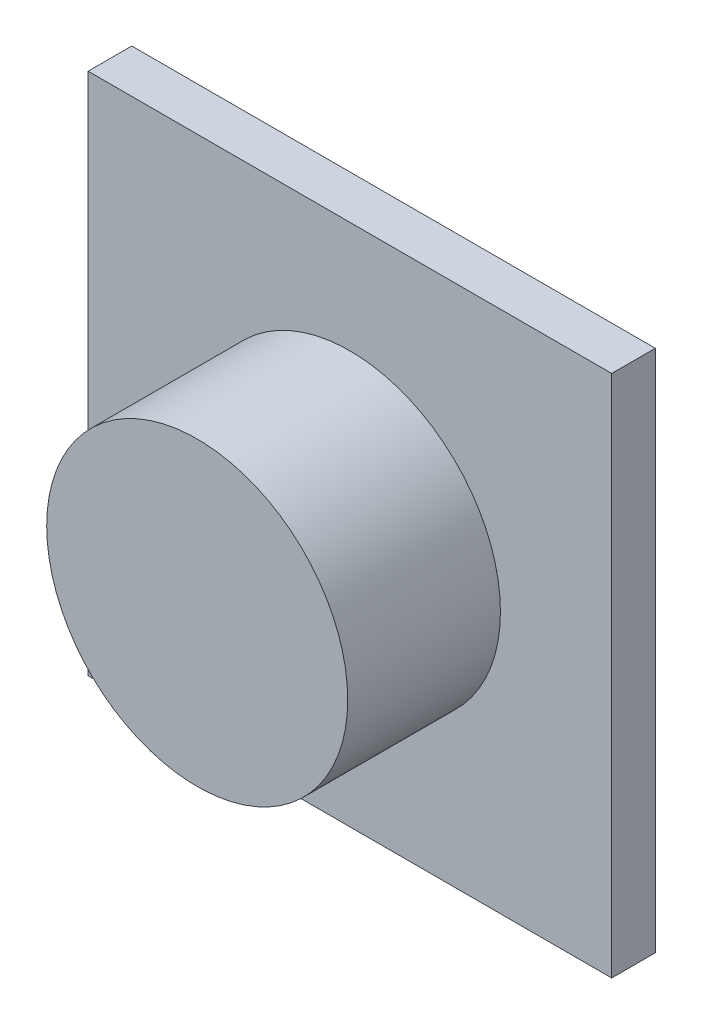
ISO-10303-21;
HEADER;
FILE_DESCRIPTION(('STEP AP214'),'2;1');
FILE_NAME('part.step','',(''),(''),'','','');
FILE_SCHEMA(('AUTOMOTIVE_DESIGN { 1 0 10303 214 1 1 1 1 }'));
ENDSEC;
DATA;
#1=APPLICATION_CONTEXT('core data for automotive mechanical design processes');
#2=APPLICATION_PROTOCOL_DEFINITION('international standard','automotive_design',2000,#1);
#3=PRODUCT_CONTEXT('',#1,'mechanical');
#4=PRODUCT('Part','Part','',(#3));
#5=PRODUCT_RELATED_PRODUCT_CATEGORY('part','',(#4));
#6=PRODUCT_DEFINITION_FORMATION('','',#4);
#7=PRODUCT_DEFINITION_CONTEXT('part definition',#1,'design');
#8=PRODUCT_DEFINITION('design','',#6,#7);
#9=PRODUCT_DEFINITION_SHAPE('','',#8);
#10=(LENGTH_UNIT() NAMED_UNIT(*) SI_UNIT(.MILLI.,.METRE.));
#11=(NAMED_UNIT(*) PLANE_ANGLE_UNIT() SI_UNIT($,.RADIAN.));
#12=(NAMED_UNIT(*) SI_UNIT($,.STERADIAN.) SOLID_ANGLE_UNIT());
#13=UNCERTAINTY_MEASURE_WITH_UNIT(LENGTH_MEASURE(1.E-05),#10,'distance_accuracy_value','');
#14=(GEOMETRIC_REPRESENTATION_CONTEXT(3) GLOBAL_UNCERTAINTY_ASSIGNED_CONTEXT((#13)) GLOBAL_UNIT_ASSIGNED_CONTEXT((#10,
#11,#12)) REPRESENTATION_CONTEXT('',''));
#15=CARTESIAN_POINT('',(0.,0.,0.));
#16=DIRECTION('',(0.,0.,1.));
#17=DIRECTION('',(1.,0.,0.));
#18=AXIS2_PLACEMENT_3D('',#15,#16,#17);
#19=CARTESIAN_POINT('',(-10.3425605536332,-5.83667820069204,1.));
#20=DIRECTION('',(0.,1.,0.));
#21=DIRECTION('',(0.,0.,1.));
#22=AXIS2_PLACEMENT_3D('',#19,#20,#21);
#23=PLANE('',#22);
#24=DIRECTION('',(1.,0.,0.));
#25=VECTOR('',#24,1.);
#26=CARTESIAN_POINT('',(-10.3425605536332,-5.83667820069204,0.));
#27=LINE('',#26,#25);
#28=CARTESIAN_POINT('',(-10.3425605536332,-5.83667820069204,0.));
#29=VERTEX_POINT('',#28);
#30=CARTESIAN_POINT('',(1.65743944636678,-5.83667820069204,0.));
#31=VERTEX_POINT('',#30);
#32=EDGE_CURVE('E109',#29,#31,#27,.T.);
#33=ORIENTED_EDGE('',*,*,#32,.T.);
#34=DIRECTION('',(0.,0.,-1.));
#35=VECTOR('',#34,1.);
#36=CARTESIAN_POINT('',(1.65743944636678,-5.83667820069204,1.));
#37=LINE('',#36,#35);
#38=CARTESIAN_POINT('',(1.65743944636678,-5.83667820069204,1.));
#39=VERTEX_POINT('',#38);
#40=EDGE_CURVE('E42',#39,#31,#37,.T.);
#41=ORIENTED_EDGE('',*,*,#40,.F.);
#42=DIRECTION('',(1.,0.,0.));
#43=VECTOR('',#42,1.);
#44=CARTESIAN_POINT('',(-10.3425605536332,-5.83667820069204,1.));
#45=LINE('',#44,#43);
#46=CARTESIAN_POINT('',(-10.3425605536332,-5.83667820069204,1.));
#47=VERTEX_POINT('',#46);
#48=EDGE_CURVE('E81',#47,#39,#45,.T.);
#49=ORIENTED_EDGE('',*,*,#48,.F.);
#50=DIRECTION('',(0.,0.,-1.));
#51=VECTOR('',#50,1.);
#52=CARTESIAN_POINT('',(-10.3425605536332,-5.83667820069204,1.));
#53=LINE('',#52,#51);
#54=EDGE_CURVE('E105',#47,#29,#53,.T.);
#55=ORIENTED_EDGE('',*,*,#54,.T.);
#56=EDGE_LOOP('',(#33,#41,#49,#55));
#57=FACE_BOUND('',#56,.T.);
#58=ADVANCED_FACE('F39',(#57),#23,.F.);
#59=CARTESIAN_POINT('',(1.65743944636678,6.16332179930796,1.));
#60=DIRECTION('',(1.,0.,0.));
#61=DIRECTION('',(0.,1.,0.));
#62=AXIS2_PLACEMENT_3D('',#59,#60,#61);
#63=PLANE('',#62);
#64=DIRECTION('',(0.,-1.,0.));
#65=VECTOR('',#64,1.);
#66=CARTESIAN_POINT('',(1.65743944636678,6.16332179930796,0.));
#67=LINE('',#66,#65);
#68=CARTESIAN_POINT('',(1.65743944636678,6.16332179930796,0.));
#69=VERTEX_POINT('',#68);
#70=EDGE_CURVE('E91',#69,#31,#67,.T.);
#71=ORIENTED_EDGE('',*,*,#70,.F.);
#72=DIRECTION('',(0.,0.,-1.));
#73=VECTOR('',#72,1.);
#74=CARTESIAN_POINT('',(1.65743944636678,6.16332179930796,1.));
#75=LINE('',#74,#73);
#76=CARTESIAN_POINT('',(1.65743944636678,6.16332179930796,1.));
#77=VERTEX_POINT('',#76);
#78=EDGE_CURVE('E87',#77,#69,#75,.T.);
#79=ORIENTED_EDGE('',*,*,#78,.F.);
#80=DIRECTION('',(0.,-1.,0.));
#81=VECTOR('',#80,1.);
#82=CARTESIAN_POINT('',(1.65743944636678,6.16332179930796,1.));
#83=LINE('',#82,#81);
#84=EDGE_CURVE('E89',#77,#39,#83,.T.);
#85=ORIENTED_EDGE('',*,*,#84,.T.);
#86=ORIENTED_EDGE('',*,*,#40,.T.);
#87=EDGE_LOOP('',(#71,#79,#85,#86));
#88=FACE_BOUND('',#87,.T.);
#89=ADVANCED_FACE('F88',(#88),#63,.T.);
#90=CARTESIAN_POINT('',(-10.3425605536332,6.16332179930796,1.));
#91=DIRECTION('',(0.,1.,0.));
#92=DIRECTION('',(0.,0.,1.));
#93=AXIS2_PLACEMENT_3D('',#90,#91,#92);
#94=PLANE('',#93);
#95=DIRECTION('',(1.,0.,0.));
#96=VECTOR('',#95,1.);
#97=CARTESIAN_POINT('',(-10.3425605536332,6.16332179930796,0.));
#98=LINE('',#97,#96);
#99=CARTESIAN_POINT('',(-10.3425605536332,6.16332179930796,0.));
#100=VERTEX_POINT('',#99);
#101=EDGE_CURVE('E116',#100,#69,#98,.T.);
#102=ORIENTED_EDGE('',*,*,#101,.F.);
#103=DIRECTION('',(0.,0.,-1.));
#104=VECTOR('',#103,1.);
#105=CARTESIAN_POINT('',(-10.3425605536332,6.16332179930796,1.));
#106=LINE('',#105,#104);
#107=CARTESIAN_POINT('',(-10.3425605536332,6.16332179930796,1.));
#108=VERTEX_POINT('',#107);
#109=EDGE_CURVE('E73',#108,#100,#106,.T.);
#110=ORIENTED_EDGE('',*,*,#109,.F.);
#111=DIRECTION('',(1.,0.,0.));
#112=VECTOR('',#111,1.);
#113=CARTESIAN_POINT('',(-10.3425605536332,6.16332179930796,1.));
#114=LINE('',#113,#112);
#115=EDGE_CURVE('E98',#108,#77,#114,.T.);
#116=ORIENTED_EDGE('',*,*,#115,.T.);
#117=ORIENTED_EDGE('',*,*,#78,.T.);
#118=EDGE_LOOP('',(#102,#110,#116,#117));
#119=FACE_BOUND('',#118,.T.);
#120=ADVANCED_FACE('F101',(#119),#94,.T.);
#121=CARTESIAN_POINT('',(-10.3425605536332,6.16332179930796,1.));
#122=DIRECTION('',(1.,0.,0.));
#123=DIRECTION('',(0.,1.,0.));
#124=AXIS2_PLACEMENT_3D('',#121,#122,#123);
#125=PLANE('',#124);
#126=DIRECTION('',(0.,-1.,0.));
#127=VECTOR('',#126,1.);
#128=CARTESIAN_POINT('',(-10.3425605536332,6.16332179930796,0.));
#129=LINE('',#128,#127);
#130=EDGE_CURVE('E76',#100,#29,#129,.T.);
#131=ORIENTED_EDGE('',*,*,#130,.T.);
#132=ORIENTED_EDGE('',*,*,#54,.F.);
#133=DIRECTION('',(0.,-1.,0.));
#134=VECTOR('',#133,1.);
#135=CARTESIAN_POINT('',(-10.3425605536332,6.16332179930796,1.));
#136=LINE('',#135,#134);
#137=EDGE_CURVE('E57',#108,#47,#136,.T.);
#138=ORIENTED_EDGE('',*,*,#137,.F.);
#139=ORIENTED_EDGE('',*,*,#109,.T.);
#140=EDGE_LOOP('',(#131,#132,#138,#139));
#141=FACE_BOUND('',#140,.T.);
#142=ADVANCED_FACE('F139',(#141),#125,.F.);
#143=CARTESIAN_POINT('',(0.,0.,1.));
#144=DIRECTION('',(0.,0.,-1.));
#145=DIRECTION('',(-1.,0.,0.));
#146=AXIS2_PLACEMENT_3D('',#143,#144,#145);
#147=PLANE('',#146);
#148=CARTESIAN_POINT('',(-4.34256055363322,0.163321799307959,1.));
#149=DIRECTION('',(0.,0.,1.));
#150=DIRECTION('',(1.,0.,0.));
#151=AXIS2_PLACEMENT_3D('',#148,#149,#150);
#152=CIRCLE('',#151,3.45);
#153=CARTESIAN_POINT('',(-0.892560553633223,0.163321799307959,1.));
#154=VERTEX_POINT('',#153);
#155=EDGE_CURVE('E11',#154,#154,#152,.T.);
#156=ORIENTED_EDGE('',*,*,#155,.F.);
#157=EDGE_LOOP('',(#156));
#158=FACE_BOUND('',#157,.T.);
#159=ORIENTED_EDGE('',*,*,#48,.T.);
#160=ORIENTED_EDGE('',*,*,#84,.F.);
#161=ORIENTED_EDGE('',*,*,#115,.F.);
#162=ORIENTED_EDGE('',*,*,#137,.T.);
#163=EDGE_LOOP('',(#159,#160,#161,#162));
#164=FACE_BOUND('',#163,.T.);
#165=ADVANCED_FACE('F97',(#158,#164),#147,.F.);
#166=CARTESIAN_POINT('',(0.,0.,0.));
#167=DIRECTION('',(0.,0.,-1.));
#168=DIRECTION('',(-1.,0.,0.));
#169=AXIS2_PLACEMENT_3D('',#166,#167,#168);
#170=PLANE('',#169);
#171=ORIENTED_EDGE('',*,*,#32,.F.);
#172=ORIENTED_EDGE('',*,*,#130,.F.);
#173=ORIENTED_EDGE('',*,*,#101,.T.);
#174=ORIENTED_EDGE('',*,*,#70,.T.);
#175=EDGE_LOOP('',(#171,#172,#173,#174));
#176=FACE_BOUND('',#175,.T.);
#177=ADVANCED_FACE('F128',(#176),#170,.T.);
#178=CARTESIAN_POINT('',(-4.34256055363322,0.163321799307959,4.5));
#179=DIRECTION('',(0.,0.,-1.));
#180=DIRECTION('',(-1.,0.,0.));
#181=AXIS2_PLACEMENT_3D('',#178,#179,#180);
#182=CYLINDRICAL_SURFACE('',#181,3.45);
#183=CARTESIAN_POINT('',(-4.34256055363322,0.163321799307959,4.5));
#184=DIRECTION('',(0.,0.,1.));
#185=DIRECTION('',(1.,0.,0.));
#186=AXIS2_PLACEMENT_3D('',#183,#184,#185);
#187=CIRCLE('',#186,3.45);
#188=CARTESIAN_POINT('',(-0.892560553633223,0.163321799307959,4.5));
#189=VERTEX_POINT('',#188);
#190=EDGE_CURVE('E113',#189,#189,#187,.T.);
#191=ORIENTED_EDGE('',*,*,#190,.F.);
#192=EDGE_LOOP('',(#191));
#193=FACE_BOUND('',#192,.T.);
#194=ORIENTED_EDGE('',*,*,#155,.T.);
#195=EDGE_LOOP('',(#194));
#196=FACE_BOUND('',#195,.T.);
#197=ADVANCED_FACE('F130',(#193,#196),#182,.T.);
#198=CARTESIAN_POINT('',(-4.34256055363322,0.163321799307959,4.5));
#199=DIRECTION('',(0.,0.,1.));
#200=DIRECTION('',(1.,0.,0.));
#201=AXIS2_PLACEMENT_3D('',#198,#199,#200);
#202=PLANE('',#201);
#203=ORIENTED_EDGE('',*,*,#190,.T.);
#204=EDGE_LOOP('',(#203));
#205=FACE_BOUND('',#204,.T.);
#206=ADVANCED_FACE('F136',(#205),#202,.T.);
#207=CLOSED_SHELL('',(#58,#89,#120,#142,#165,#177,#197,#206));
#208=MANIFOLD_SOLID_BREP('B2',#207);
#209=ADVANCED_BREP_SHAPE_REPRESENTATION('',(#18,#208),#14);
#210=SHAPE_DEFINITION_REPRESENTATION(#9,#209);
ENDSEC;
END-ISO-10303-21;
